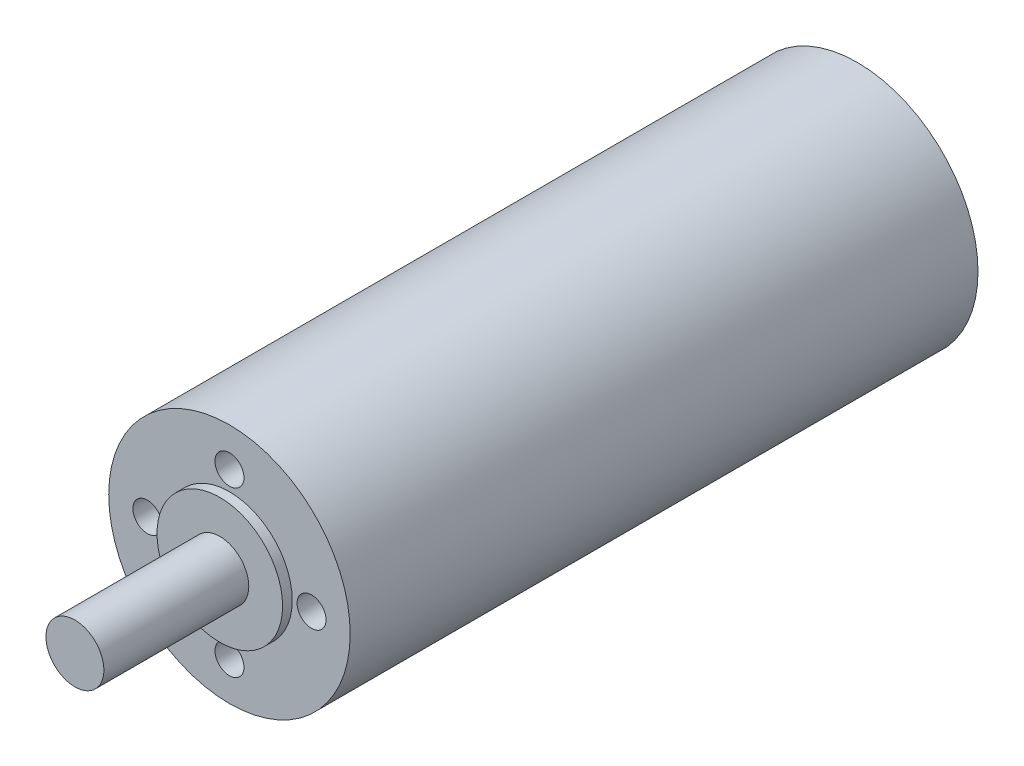
ISO-10303-21;
HEADER;
FILE_DESCRIPTION(('STEP AP214'),'2;1');
FILE_NAME('part.step','',(''),(''),'','','');
FILE_SCHEMA(('AUTOMOTIVE_DESIGN { 1 0 10303 214 1 1 1 1 }'));
ENDSEC;
DATA;
#1=APPLICATION_CONTEXT('core data for automotive mechanical design processes');
#2=APPLICATION_PROTOCOL_DEFINITION('international standard','automotive_design',2000,#1);
#3=PRODUCT_CONTEXT('',#1,'mechanical');
#4=PRODUCT('Part','Part','',(#3));
#5=PRODUCT_RELATED_PRODUCT_CATEGORY('part','',(#4));
#6=PRODUCT_DEFINITION_FORMATION('','',#4);
#7=PRODUCT_DEFINITION_CONTEXT('part definition',#1,'design');
#8=PRODUCT_DEFINITION('design','',#6,#7);
#9=PRODUCT_DEFINITION_SHAPE('','',#8);
#10=(LENGTH_UNIT() NAMED_UNIT(*) SI_UNIT(.MILLI.,.METRE.));
#11=(NAMED_UNIT(*) PLANE_ANGLE_UNIT() SI_UNIT($,.RADIAN.));
#12=(NAMED_UNIT(*) SI_UNIT($,.STERADIAN.) SOLID_ANGLE_UNIT());
#13=UNCERTAINTY_MEASURE_WITH_UNIT(LENGTH_MEASURE(1.E-05),#10,'distance_accuracy_value','');
#14=(GEOMETRIC_REPRESENTATION_CONTEXT(3) GLOBAL_UNCERTAINTY_ASSIGNED_CONTEXT((#13)) GLOBAL_UNIT_ASSIGNED_CONTEXT((#10,
#11,#12)) REPRESENTATION_CONTEXT('',''));
#15=CARTESIAN_POINT('',(0.,0.,0.));
#16=DIRECTION('',(0.,0.,1.));
#17=DIRECTION('',(1.,0.,0.));
#18=AXIS2_PLACEMENT_3D('',#15,#16,#17);
#19=CARTESIAN_POINT('',(0.,0.,65.));
#20=DIRECTION('',(0.,0.,-1.));
#21=DIRECTION('',(-1.,0.,0.));
#22=AXIS2_PLACEMENT_3D('',#19,#20,#21);
#23=CYLINDRICAL_SURFACE('',#22,12.5);
#24=CARTESIAN_POINT('',(0.,0.,65.));
#25=DIRECTION('',(0.,0.,1.));
#26=DIRECTION('',(1.,0.,0.));
#27=AXIS2_PLACEMENT_3D('',#24,#25,#26);
#28=CIRCLE('',#27,12.5);
#29=CARTESIAN_POINT('',(12.5,0.,65.));
#30=VERTEX_POINT('',#29);
#31=EDGE_CURVE('E43',#30,#30,#28,.T.);
#32=ORIENTED_EDGE('',*,*,#31,.F.);
#33=EDGE_LOOP('',(#32));
#34=FACE_BOUND('',#33,.T.);
#35=CARTESIAN_POINT('',(0.,0.,0.));
#36=DIRECTION('',(0.,0.,1.));
#37=DIRECTION('',(1.,0.,0.));
#38=AXIS2_PLACEMENT_3D('',#35,#36,#37);
#39=CIRCLE('',#38,12.5);
#40=CARTESIAN_POINT('',(12.5,0.,0.));
#41=VERTEX_POINT('',#40);
#42=EDGE_CURVE('E34',#41,#41,#39,.T.);
#43=ORIENTED_EDGE('',*,*,#42,.T.);
#44=EDGE_LOOP('',(#43));
#45=FACE_BOUND('',#44,.T.);
#46=ADVANCED_FACE('F31',(#34,#45),#23,.T.);
#47=CARTESIAN_POINT('',(0.,0.,65.));
#48=DIRECTION('',(0.,0.,1.));
#49=DIRECTION('',(1.,0.,0.));
#50=AXIS2_PLACEMENT_3D('',#47,#48,#49);
#51=PLANE('',#50);
#52=CARTESIAN_POINT('',(-8.5,0.,65.));
#53=DIRECTION('',(0.,0.,1.));
#54=DIRECTION('',(0.,-1.,0.));
#55=AXIS2_PLACEMENT_3D('',#52,#53,#54);
#56=CIRCLE('',#55,1.5);
#57=CARTESIAN_POINT('',(-8.50000000000001,-1.49999999999997,65.));
#58=VERTEX_POINT('',#57);
#59=EDGE_CURVE('E230',#58,#58,#56,.T.);
#60=ORIENTED_EDGE('',*,*,#59,.F.);
#61=EDGE_LOOP('',(#60));
#62=FACE_BOUND('',#61,.T.);
#63=CARTESIAN_POINT('',(0.,8.5,65.));
#64=DIRECTION('',(0.,0.,1.));
#65=DIRECTION('',(-1.,0.,0.));
#66=AXIS2_PLACEMENT_3D('',#63,#64,#65);
#67=CIRCLE('',#66,1.5);
#68=CARTESIAN_POINT('',(-1.5,8.5,65.));
#69=VERTEX_POINT('',#68);
#70=EDGE_CURVE('E224',#69,#69,#67,.T.);
#71=ORIENTED_EDGE('',*,*,#70,.F.);
#72=EDGE_LOOP('',(#71));
#73=FACE_BOUND('',#72,.T.);
#74=CARTESIAN_POINT('',(8.5,0.,65.));
#75=DIRECTION('',(0.,0.,1.));
#76=DIRECTION('',(0.,1.,0.));
#77=AXIS2_PLACEMENT_3D('',#74,#75,#76);
#78=CIRCLE('',#77,1.5);
#79=CARTESIAN_POINT('',(8.50000000000002,1.49999999999991,65.));
#80=VERTEX_POINT('',#79);
#81=EDGE_CURVE('E218',#80,#80,#78,.T.);
#82=ORIENTED_EDGE('',*,*,#81,.F.);
#83=EDGE_LOOP('',(#82));
#84=FACE_BOUND('',#83,.T.);
#85=CARTESIAN_POINT('',(0.,-8.5,65.));
#86=DIRECTION('',(0.,0.,1.));
#87=DIRECTION('',(1.,0.,0.));
#88=AXIS2_PLACEMENT_3D('',#85,#86,#87);
#89=CIRCLE('',#88,1.5);
#90=CARTESIAN_POINT('',(1.5,-8.5,65.));
#91=VERTEX_POINT('',#90);
#92=EDGE_CURVE('E212',#91,#91,#89,.T.);
#93=ORIENTED_EDGE('',*,*,#92,.F.);
#94=EDGE_LOOP('',(#93));
#95=FACE_BOUND('',#94,.T.);
#96=CARTESIAN_POINT('',(0.,0.,65.));
#97=DIRECTION('',(0.,0.,1.));
#98=DIRECTION('',(1.,0.,0.));
#99=AXIS2_PLACEMENT_3D('',#96,#97,#98);
#100=CIRCLE('',#99,6.5);
#101=CARTESIAN_POINT('',(6.5,0.,65.));
#102=VERTEX_POINT('',#101);
#103=EDGE_CURVE('E38',#102,#102,#100,.T.);
#104=ORIENTED_EDGE('',*,*,#103,.F.);
#105=EDGE_LOOP('',(#104));
#106=FACE_BOUND('',#105,.T.);
#107=ORIENTED_EDGE('',*,*,#31,.T.);
#108=EDGE_LOOP('',(#107));
#109=FACE_BOUND('',#108,.T.);
#110=ADVANCED_FACE('F61',(#62,#73,#84,#95,#106,#109),#51,.T.);
#111=CARTESIAN_POINT('',(0.,0.,0.));
#112=DIRECTION('',(0.,0.,1.));
#113=DIRECTION('',(1.,0.,0.));
#114=AXIS2_PLACEMENT_3D('',#111,#112,#113);
#115=PLANE('',#114);
#116=ORIENTED_EDGE('',*,*,#42,.F.);
#117=EDGE_LOOP('',(#116));
#118=FACE_BOUND('',#117,.T.);
#119=ADVANCED_FACE('F58',(#118),#115,.F.);
#120=CARTESIAN_POINT('',(0.,0.,66.));
#121=DIRECTION('',(0.,0.,-1.));
#122=DIRECTION('',(-1.,0.,0.));
#123=AXIS2_PLACEMENT_3D('',#120,#121,#122);
#124=CYLINDRICAL_SURFACE('',#123,6.5);
#125=CARTESIAN_POINT('',(0.,0.,66.));
#126=DIRECTION('',(0.,0.,1.));
#127=DIRECTION('',(1.,0.,0.));
#128=AXIS2_PLACEMENT_3D('',#125,#126,#127);
#129=CIRCLE('',#128,6.5);
#130=CARTESIAN_POINT('',(6.5,0.,66.));
#131=VERTEX_POINT('',#130);
#132=EDGE_CURVE('E49',#131,#131,#129,.T.);
#133=ORIENTED_EDGE('',*,*,#132,.F.);
#134=EDGE_LOOP('',(#133));
#135=FACE_BOUND('',#134,.T.);
#136=ORIENTED_EDGE('',*,*,#103,.T.);
#137=EDGE_LOOP('',(#136));
#138=FACE_BOUND('',#137,.T.);
#139=ADVANCED_FACE('F60',(#135,#138),#124,.T.);
#140=CARTESIAN_POINT('',(0.,0.,66.));
#141=DIRECTION('',(0.,0.,1.));
#142=DIRECTION('',(1.,0.,0.));
#143=AXIS2_PLACEMENT_3D('',#140,#141,#142);
#144=PLANE('',#143);
#145=CARTESIAN_POINT('',(0.,0.,66.));
#146=DIRECTION('',(0.,0.,1.));
#147=DIRECTION('',(1.,0.,0.));
#148=AXIS2_PLACEMENT_3D('',#145,#146,#147);
#149=CIRCLE('',#148,3.);
#150=CARTESIAN_POINT('',(3.,0.,66.));
#151=VERTEX_POINT('',#150);
#152=EDGE_CURVE('E10',#151,#151,#149,.T.);
#153=ORIENTED_EDGE('',*,*,#152,.F.);
#154=EDGE_LOOP('',(#153));
#155=FACE_BOUND('',#154,.T.);
#156=ORIENTED_EDGE('',*,*,#132,.T.);
#157=EDGE_LOOP('',(#156));
#158=FACE_BOUND('',#157,.T.);
#159=ADVANCED_FACE('F66',(#155,#158),#144,.T.);
#160=CARTESIAN_POINT('',(0.,0.,81.));
#161=DIRECTION('',(0.,0.,-1.));
#162=DIRECTION('',(-1.,0.,0.));
#163=AXIS2_PLACEMENT_3D('',#160,#161,#162);
#164=CYLINDRICAL_SURFACE('',#163,3.);
#165=CARTESIAN_POINT('',(0.,0.,81.));
#166=DIRECTION('',(0.,0.,1.));
#167=DIRECTION('',(1.,0.,0.));
#168=AXIS2_PLACEMENT_3D('',#165,#166,#167);
#169=CIRCLE('',#168,3.);
#170=CARTESIAN_POINT('',(3.,0.,81.));
#171=VERTEX_POINT('',#170);
#172=EDGE_CURVE('E47',#171,#171,#169,.T.);
#173=ORIENTED_EDGE('',*,*,#172,.F.);
#174=EDGE_LOOP('',(#173));
#175=FACE_BOUND('',#174,.T.);
#176=ORIENTED_EDGE('',*,*,#152,.T.);
#177=EDGE_LOOP('',(#176));
#178=FACE_BOUND('',#177,.T.);
#179=ADVANCED_FACE('F161',(#175,#178),#164,.T.);
#180=CARTESIAN_POINT('',(0.,0.,81.));
#181=DIRECTION('',(0.,0.,1.));
#182=DIRECTION('',(1.,0.,0.));
#183=AXIS2_PLACEMENT_3D('',#180,#181,#182);
#184=PLANE('',#183);
#185=ORIENTED_EDGE('',*,*,#172,.T.);
#186=EDGE_LOOP('',(#185));
#187=FACE_BOUND('',#186,.T.);
#188=ADVANCED_FACE('F157',(#187),#184,.T.);
#189=CARTESIAN_POINT('',(0.,-8.5,61.));
#190=DIRECTION('',(0.,0.,1.));
#191=DIRECTION('',(1.,0.,0.));
#192=AXIS2_PLACEMENT_3D('',#189,#190,#191);
#193=CYLINDRICAL_SURFACE('',#192,1.5);
#194=CARTESIAN_POINT('',(0.,-8.5,61.));
#195=DIRECTION('',(0.,0.,1.));
#196=DIRECTION('',(1.,0.,0.));
#197=AXIS2_PLACEMENT_3D('',#194,#195,#196);
#198=CIRCLE('',#197,1.5);
#199=CARTESIAN_POINT('',(1.5,-8.5,61.));
#200=VERTEX_POINT('',#199);
#201=EDGE_CURVE('E210',#200,#200,#198,.T.);
#202=ORIENTED_EDGE('',*,*,#201,.F.);
#203=EDGE_LOOP('',(#202));
#204=FACE_BOUND('',#203,.T.);
#205=ORIENTED_EDGE('',*,*,#92,.T.);
#206=EDGE_LOOP('',(#205));
#207=FACE_BOUND('',#206,.T.);
#208=ADVANCED_FACE('F153',(#204,#207),#193,.F.);
#209=CARTESIAN_POINT('',(0.,-8.5,61.));
#210=DIRECTION('',(0.,0.,1.));
#211=DIRECTION('',(1.,0.,0.));
#212=AXIS2_PLACEMENT_3D('',#209,#210,#211);
#213=PLANE('',#212);
#214=ORIENTED_EDGE('',*,*,#201,.T.);
#215=EDGE_LOOP('',(#214));
#216=FACE_BOUND('',#215,.T.);
#217=ADVANCED_FACE('F86',(#216),#213,.T.);
#218=CARTESIAN_POINT('',(8.5,0.,61.));
#219=DIRECTION('',(0.,0.,1.));
#220=DIRECTION('',(1.,0.,0.));
#221=AXIS2_PLACEMENT_3D('',#218,#219,#220);
#222=CYLINDRICAL_SURFACE('',#221,1.5);
#223=CARTESIAN_POINT('',(8.5,0.,61.));
#224=DIRECTION('',(0.,0.,1.));
#225=DIRECTION('',(0.,1.,0.));
#226=AXIS2_PLACEMENT_3D('',#223,#224,#225);
#227=CIRCLE('',#226,1.5);
#228=CARTESIAN_POINT('',(8.50000000000002,1.49999999999991,61.));
#229=VERTEX_POINT('',#228);
#230=EDGE_CURVE('E221',#229,#229,#227,.T.);
#231=ORIENTED_EDGE('',*,*,#230,.F.);
#232=EDGE_LOOP('',(#231));
#233=FACE_BOUND('',#232,.T.);
#234=ORIENTED_EDGE('',*,*,#81,.T.);
#235=EDGE_LOOP('',(#234));
#236=FACE_BOUND('',#235,.T.);
#237=ADVANCED_FACE('F91',(#233,#236),#222,.F.);
#238=CARTESIAN_POINT('',(8.5,0.,61.));
#239=DIRECTION('',(0.,0.,1.));
#240=DIRECTION('',(0.,1.,0.));
#241=AXIS2_PLACEMENT_3D('',#238,#239,#240);
#242=PLANE('',#241);
#243=ORIENTED_EDGE('',*,*,#230,.T.);
#244=EDGE_LOOP('',(#243));
#245=FACE_BOUND('',#244,.T.);
#246=ADVANCED_FACE('F96',(#245),#242,.T.);
#247=CARTESIAN_POINT('',(0.,8.5,61.));
#248=DIRECTION('',(0.,0.,1.));
#249=DIRECTION('',(1.,0.,0.));
#250=AXIS2_PLACEMENT_3D('',#247,#248,#249);
#251=CYLINDRICAL_SURFACE('',#250,1.5);
#252=CARTESIAN_POINT('',(0.,8.5,61.));
#253=DIRECTION('',(0.,0.,1.));
#254=DIRECTION('',(-1.,0.,0.));
#255=AXIS2_PLACEMENT_3D('',#252,#253,#254);
#256=CIRCLE('',#255,1.5);
#257=CARTESIAN_POINT('',(-1.5,8.5,61.));
#258=VERTEX_POINT('',#257);
#259=EDGE_CURVE('E227',#258,#258,#256,.T.);
#260=ORIENTED_EDGE('',*,*,#259,.F.);
#261=EDGE_LOOP('',(#260));
#262=FACE_BOUND('',#261,.T.);
#263=ORIENTED_EDGE('',*,*,#70,.T.);
#264=EDGE_LOOP('',(#263));
#265=FACE_BOUND('',#264,.T.);
#266=ADVANCED_FACE('F106',(#262,#265),#251,.F.);
#267=CARTESIAN_POINT('',(0.,8.5,61.));
#268=DIRECTION('',(0.,0.,1.));
#269=DIRECTION('',(-1.,0.,0.));
#270=AXIS2_PLACEMENT_3D('',#267,#268,#269);
#271=PLANE('',#270);
#272=ORIENTED_EDGE('',*,*,#259,.T.);
#273=EDGE_LOOP('',(#272));
#274=FACE_BOUND('',#273,.T.);
#275=ADVANCED_FACE('F116',(#274),#271,.T.);
#276=CARTESIAN_POINT('',(-8.5,0.,61.));
#277=DIRECTION('',(0.,0.,1.));
#278=DIRECTION('',(1.,0.,0.));
#279=AXIS2_PLACEMENT_3D('',#276,#277,#278);
#280=CYLINDRICAL_SURFACE('',#279,1.5);
#281=CARTESIAN_POINT('',(-8.5,0.,61.));
#282=DIRECTION('',(0.,0.,1.));
#283=DIRECTION('',(0.,-1.,0.));
#284=AXIS2_PLACEMENT_3D('',#281,#282,#283);
#285=CIRCLE('',#284,1.5);
#286=CARTESIAN_POINT('',(-8.50000000000001,-1.49999999999997,61.));
#287=VERTEX_POINT('',#286);
#288=EDGE_CURVE('E216',#287,#287,#285,.T.);
#289=ORIENTED_EDGE('',*,*,#288,.F.);
#290=EDGE_LOOP('',(#289));
#291=FACE_BOUND('',#290,.T.);
#292=ORIENTED_EDGE('',*,*,#59,.T.);
#293=EDGE_LOOP('',(#292));
#294=FACE_BOUND('',#293,.T.);
#295=ADVANCED_FACE('F126',(#291,#294),#280,.F.);
#296=CARTESIAN_POINT('',(-8.5,0.,61.));
#297=DIRECTION('',(0.,0.,1.));
#298=DIRECTION('',(0.,-1.,0.));
#299=AXIS2_PLACEMENT_3D('',#296,#297,#298);
#300=PLANE('',#299);
#301=ORIENTED_EDGE('',*,*,#288,.T.);
#302=EDGE_LOOP('',(#301));
#303=FACE_BOUND('',#302,.T.);
#304=ADVANCED_FACE('F136',(#303),#300,.T.);
#305=CLOSED_SHELL('',(#46,#110,#119,#139,#159,#179,#188,#208,#217,#237,#246,#266,#275,#295,#304));
#306=MANIFOLD_SOLID_BREP('B2',#305);
#307=ADVANCED_BREP_SHAPE_REPRESENTATION('',(#18,#306),#14);
#308=SHAPE_DEFINITION_REPRESENTATION(#9,#307);
ENDSEC;
END-ISO-10303-21;
